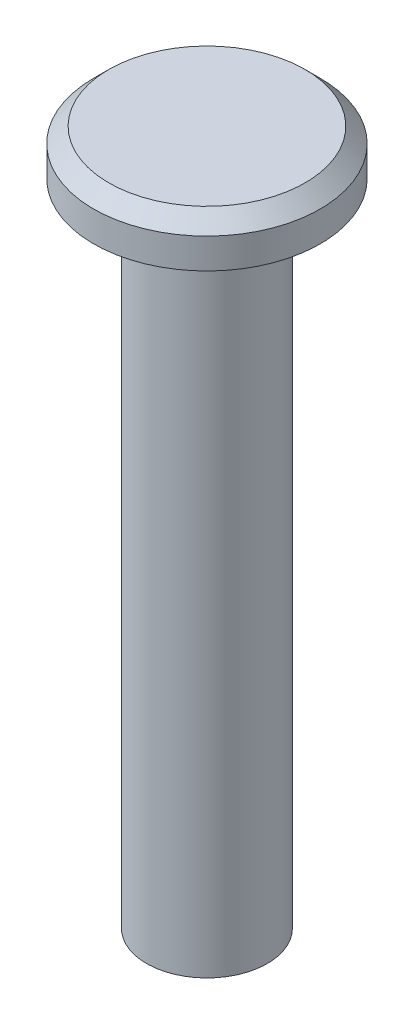
ISO-10303-21;
HEADER;
FILE_DESCRIPTION(('STEP AP214'),'2;1');
FILE_NAME('part.step','',(''),(''),'','','');
FILE_SCHEMA(('AUTOMOTIVE_DESIGN { 1 0 10303 214 1 1 1 1 }'));
ENDSEC;
DATA;
#1=APPLICATION_CONTEXT('core data for automotive mechanical design processes');
#2=APPLICATION_PROTOCOL_DEFINITION('international standard','automotive_design',2000,#1);
#3=PRODUCT_CONTEXT('',#1,'mechanical');
#4=PRODUCT('Part','Part','',(#3));
#5=PRODUCT_RELATED_PRODUCT_CATEGORY('part','',(#4));
#6=PRODUCT_DEFINITION_FORMATION('','',#4);
#7=PRODUCT_DEFINITION_CONTEXT('part definition',#1,'design');
#8=PRODUCT_DEFINITION('design','',#6,#7);
#9=PRODUCT_DEFINITION_SHAPE('','',#8);
#10=(LENGTH_UNIT() NAMED_UNIT(*) SI_UNIT(.MILLI.,.METRE.));
#11=(NAMED_UNIT(*) PLANE_ANGLE_UNIT() SI_UNIT($,.RADIAN.));
#12=(NAMED_UNIT(*) SI_UNIT($,.STERADIAN.) SOLID_ANGLE_UNIT());
#13=UNCERTAINTY_MEASURE_WITH_UNIT(LENGTH_MEASURE(1.E-05),#10,'distance_accuracy_value','');
#14=(GEOMETRIC_REPRESENTATION_CONTEXT(3) GLOBAL_UNCERTAINTY_ASSIGNED_CONTEXT((#13)) GLOBAL_UNIT_ASSIGNED_CONTEXT((#10,
#11,#12)) REPRESENTATION_CONTEXT('',''));
#15=CARTESIAN_POINT('',(0.,0.,0.));
#16=DIRECTION('',(0.,0.,1.));
#17=DIRECTION('',(1.,0.,0.));
#18=AXIS2_PLACEMENT_3D('',#15,#16,#17);
#19=CARTESIAN_POINT('',(0.,0.,0.));
#20=DIRECTION('',(0.,1.,0.));
#21=DIRECTION('',(-1.,0.,0.));
#22=AXIS2_PLACEMENT_3D('',#19,#20,#21);
#23=PLANE('',#22);
#24=CARTESIAN_POINT('',(0.,0.,0.));
#25=DIRECTION('',(0.,1.,0.));
#26=DIRECTION('',(-1.,0.,0.));
#27=AXIS2_PLACEMENT_3D('',#24,#25,#26);
#28=CIRCLE('',#27,4.);
#29=CARTESIAN_POINT('',(-4.,0.,0.));
#30=VERTEX_POINT('',#29);
#31=EDGE_CURVE('E10',#30,#30,#28,.T.);
#32=ORIENTED_EDGE('',*,*,#31,.F.);
#33=EDGE_LOOP('',(#32));
#34=FACE_BOUND('',#33,.T.);
#35=ADVANCED_FACE('F45',(#34),#23,.F.);
#36=CARTESIAN_POINT('',(0.,33.6049720126705,0.));
#37=DIRECTION('',(0.,1.,0.));
#38=DIRECTION('',(-1.,0.,0.));
#39=AXIS2_PLACEMENT_3D('',#36,#37,#38);
#40=CYLINDRICAL_SURFACE('',#39,4.);
#41=CARTESIAN_POINT('',(0.,43.,0.));
#42=DIRECTION('',(0.,1.,0.));
#43=DIRECTION('',(-1.,0.,0.));
#44=AXIS2_PLACEMENT_3D('',#41,#42,#43);
#45=CIRCLE('',#44,4.00000000000001);
#46=CARTESIAN_POINT('',(-4.00000000000001,43.,0.));
#47=VERTEX_POINT('',#46);
#48=EDGE_CURVE('E51',#47,#47,#45,.T.);
#49=ORIENTED_EDGE('',*,*,#48,.F.);
#50=EDGE_LOOP('',(#49));
#51=FACE_BOUND('',#50,.T.);
#52=ORIENTED_EDGE('',*,*,#31,.T.);
#53=EDGE_LOOP('',(#52));
#54=FACE_BOUND('',#53,.T.);
#55=ADVANCED_FACE('F84',(#51,#54),#40,.T.);
#56=CARTESIAN_POINT('',(4.00000000000001,43.,0.));
#57=DIRECTION('',(0.,1.,0.));
#58=DIRECTION('',(-1.,0.,0.));
#59=AXIS2_PLACEMENT_3D('',#56,#57,#58);
#60=PLANE('',#59);
#61=CARTESIAN_POINT('',(0.,43.,0.));
#62=DIRECTION('',(0.,1.,0.));
#63=DIRECTION('',(-1.,0.,0.));
#64=AXIS2_PLACEMENT_3D('',#61,#62,#63);
#65=CIRCLE('',#64,7.5);
#66=CARTESIAN_POINT('',(-7.5,43.,0.));
#67=VERTEX_POINT('',#66);
#68=EDGE_CURVE('E55',#67,#67,#65,.T.);
#69=ORIENTED_EDGE('',*,*,#68,.F.);
#70=EDGE_LOOP('',(#69));
#71=FACE_BOUND('',#70,.T.);
#72=ORIENTED_EDGE('',*,*,#48,.T.);
#73=EDGE_LOOP('',(#72));
#74=FACE_BOUND('',#73,.T.);
#75=ADVANCED_FACE('F79',(#71,#74),#60,.F.);
#76=CARTESIAN_POINT('',(0.,33.6049720126705,0.));
#77=DIRECTION('',(0.,1.,0.));
#78=DIRECTION('',(-1.,0.,0.));
#79=AXIS2_PLACEMENT_3D('',#76,#77,#78);
#80=CYLINDRICAL_SURFACE('',#79,7.5);
#81=CARTESIAN_POINT('',(0.,45.,0.));
#82=DIRECTION('',(0.,1.,0.));
#83=DIRECTION('',(-1.,0.,0.));
#84=AXIS2_PLACEMENT_3D('',#81,#82,#83);
#85=CIRCLE('',#84,7.5);
#86=CARTESIAN_POINT('',(-7.5,45.,0.));
#87=VERTEX_POINT('',#86);
#88=EDGE_CURVE('E59',#87,#87,#85,.T.);
#89=ORIENTED_EDGE('',*,*,#88,.F.);
#90=EDGE_LOOP('',(#89));
#91=FACE_BOUND('',#90,.T.);
#92=ORIENTED_EDGE('',*,*,#68,.T.);
#93=EDGE_LOOP('',(#92));
#94=FACE_BOUND('',#93,.T.);
#95=ADVANCED_FACE('F73',(#91,#94),#80,.T.);
#96=CARTESIAN_POINT('',(0.,45.,0.));
#97=DIRECTION('',(0.,-1.,0.));
#98=DIRECTION('',(1.,0.,0.));
#99=AXIS2_PLACEMENT_3D('',#96,#97,#98);
#100=CONICAL_SURFACE('',#99,7.5,0.785398163397448);
#101=CARTESIAN_POINT('',(0.,46.,0.));
#102=DIRECTION('',(0.,1.,0.));
#103=DIRECTION('',(-1.,0.,0.));
#104=AXIS2_PLACEMENT_3D('',#101,#102,#103);
#105=CIRCLE('',#104,6.5);
#106=CARTESIAN_POINT('',(-6.5,46.,0.));
#107=VERTEX_POINT('',#106);
#108=EDGE_CURVE('E64',#107,#107,#105,.T.);
#109=ORIENTED_EDGE('',*,*,#108,.F.);
#110=EDGE_LOOP('',(#109));
#111=FACE_BOUND('',#110,.T.);
#112=ORIENTED_EDGE('',*,*,#88,.T.);
#113=EDGE_LOOP('',(#112));
#114=FACE_BOUND('',#113,.T.);
#115=ADVANCED_FACE('F70',(#111,#114),#100,.T.);
#116=CARTESIAN_POINT('',(6.5,46.,0.));
#117=DIRECTION('',(0.,-1.,0.));
#118=DIRECTION('',(1.,0.,0.));
#119=AXIS2_PLACEMENT_3D('',#116,#117,#118);
#120=PLANE('',#119);
#121=ORIENTED_EDGE('',*,*,#108,.T.);
#122=EDGE_LOOP('',(#121));
#123=FACE_BOUND('',#122,.T.);
#124=ADVANCED_FACE('F68',(#123),#120,.F.);
#125=CLOSED_SHELL('',(#35,#55,#75,#95,#115,#124));
#126=MANIFOLD_SOLID_BREP('B2',#125);
#127=ADVANCED_BREP_SHAPE_REPRESENTATION('',(#18,#126),#14);
#128=SHAPE_DEFINITION_REPRESENTATION(#9,#127);
ENDSEC;
END-ISO-10303-21;
